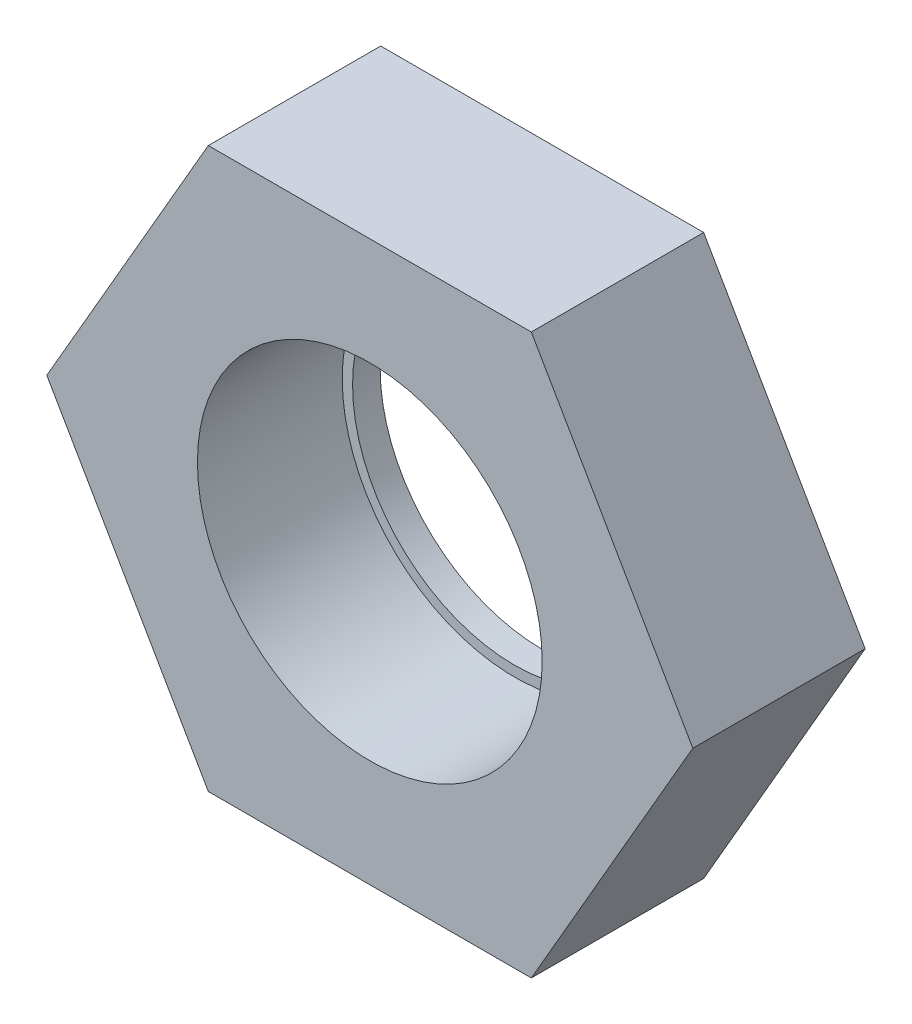
ISO-10303-21;
HEADER;
FILE_DESCRIPTION(('STEP AP214'),'2;1');
FILE_NAME('part.step','',(''),(''),'','','');
FILE_SCHEMA(('AUTOMOTIVE_DESIGN { 1 0 10303 214 1 1 1 1 }'));
ENDSEC;
DATA;
#1=APPLICATION_CONTEXT('core data for automotive mechanical design processes');
#2=APPLICATION_PROTOCOL_DEFINITION('international standard','automotive_design',2000,#1);
#3=PRODUCT_CONTEXT('',#1,'mechanical');
#4=PRODUCT('Part','Part','',(#3));
#5=PRODUCT_RELATED_PRODUCT_CATEGORY('part','',(#4));
#6=PRODUCT_DEFINITION_FORMATION('','',#4);
#7=PRODUCT_DEFINITION_CONTEXT('part definition',#1,'design');
#8=PRODUCT_DEFINITION('design','',#6,#7);
#9=PRODUCT_DEFINITION_SHAPE('','',#8);
#10=(LENGTH_UNIT() NAMED_UNIT(*) SI_UNIT(.MILLI.,.METRE.));
#11=(NAMED_UNIT(*) PLANE_ANGLE_UNIT() SI_UNIT($,.RADIAN.));
#12=(NAMED_UNIT(*) SI_UNIT($,.STERADIAN.) SOLID_ANGLE_UNIT());
#13=UNCERTAINTY_MEASURE_WITH_UNIT(LENGTH_MEASURE(1.E-05),#10,'distance_accuracy_value','');
#14=(GEOMETRIC_REPRESENTATION_CONTEXT(3) GLOBAL_UNCERTAINTY_ASSIGNED_CONTEXT((#13)) GLOBAL_UNIT_ASSIGNED_CONTEXT((#10,
#11,#12)) REPRESENTATION_CONTEXT('',''));
#15=CARTESIAN_POINT('',(0.,0.,0.));
#16=DIRECTION('',(0.,0.,1.));
#17=DIRECTION('',(1.,0.,0.));
#18=AXIS2_PLACEMENT_3D('',#15,#16,#17);
#19=CARTESIAN_POINT('',(-12.0419793196,-10.3049999894,6.35));
#20=DIRECTION('',(0.,0.,1.));
#21=DIRECTION('',(1.,0.,0.));
#22=AXIS2_PLACEMENT_3D('',#19,#20,#21);
#23=PLANE('',#22);
#24=CARTESIAN_POINT('',(0.,0.,6.35));
#25=DIRECTION('',(0.,0.,-1.));
#26=DIRECTION('',(-1.,0.,0.));
#27=AXIS2_PLACEMENT_3D('',#24,#25,#26);
#28=CIRCLE('',#27,6.35);
#29=CARTESIAN_POINT('',(-6.35,0.,6.35));
#30=VERTEX_POINT('',#29);
#31=EDGE_CURVE('E20',#30,#30,#28,.F.);
#32=ORIENTED_EDGE('',*,*,#31,.F.);
#33=EDGE_LOOP('',(#32));
#34=FACE_BOUND('',#33,.T.);
#35=DIRECTION('',(0.500000000574881,-0.866025403452531,0.));
#36=VECTOR('',#35,1.);
#37=CARTESIAN_POINT('',(8.9243917905,5.1524999947,6.35));
#38=LINE('',#37,#36);
#39=CARTESIAN_POINT('',(5.94959452477154,10.3049999894,6.35));
#40=VERTEX_POINT('',#39);
#41=CARTESIAN_POINT('',(11.8991890461852,-5.81603883977044E-09,6.35));
#42=VERTEX_POINT('',#41);
#43=EDGE_CURVE('E81',#40,#42,#38,.T.);
#44=ORIENTED_EDGE('',*,*,#43,.F.);
#45=DIRECTION('',(1.,0.,0.));
#46=VECTOR('',#45,1.);
#47=CARTESIAN_POINT('',(0.,10.3049999894,6.35));
#48=LINE('',#47,#46);
#49=CARTESIAN_POINT('',(-5.94959452477154,10.3049999894,6.35));
#50=VERTEX_POINT('',#49);
#51=EDGE_CURVE('E76',#50,#40,#48,.T.);
#52=ORIENTED_EDGE('',*,*,#51,.F.);
#53=DIRECTION('',(0.500000000574881,0.866025403452531,0.));
#54=VECTOR('',#53,1.);
#55=CARTESIAN_POINT('',(-8.9243917905,5.1524999947,6.35));
#56=LINE('',#55,#54);
#57=CARTESIAN_POINT('',(-11.8991890461852,5.81603883977044E-09,6.35));
#58=VERTEX_POINT('',#57);
#59=EDGE_CURVE('E101',#58,#50,#56,.T.);
#60=ORIENTED_EDGE('',*,*,#59,.F.);
#61=DIRECTION('',(-0.500000000574881,0.866025403452531,0.));
#62=VECTOR('',#61,1.);
#63=CARTESIAN_POINT('',(-8.9243917905,-5.1524999947,6.35));
#64=LINE('',#63,#62);
#65=CARTESIAN_POINT('',(-5.94959452477154,-10.3049999894,6.35));
#66=VERTEX_POINT('',#65);
#67=EDGE_CURVE('E125',#66,#58,#64,.T.);
#68=ORIENTED_EDGE('',*,*,#67,.F.);
#69=DIRECTION('',(-1.,0.,0.));
#70=VECTOR('',#69,1.);
#71=CARTESIAN_POINT('',(0.,-10.3049999894,6.35));
#72=LINE('',#71,#70);
#73=CARTESIAN_POINT('',(5.94959452588577,-10.3049999894,6.35));
#74=VERTEX_POINT('',#73);
#75=EDGE_CURVE('E61',#74,#66,#72,.T.);
#76=ORIENTED_EDGE('',*,*,#75,.F.);
#77=DIRECTION('',(-0.500000000574881,-0.866025403452531,0.));
#78=VECTOR('',#77,1.);
#79=CARTESIAN_POINT('',(8.9243917905,-5.1524999947,6.35));
#80=LINE('',#79,#78);
#81=EDGE_CURVE('E89',#42,#74,#80,.T.);
#82=ORIENTED_EDGE('',*,*,#81,.F.);
#83=EDGE_LOOP('',(#44,#52,#60,#68,#76,#82));
#84=FACE_BOUND('',#83,.T.);
#85=ADVANCED_FACE('F16',(#34,#84),#23,.T.);
#86=CARTESIAN_POINT('',(0.,0.,6.35));
#87=DIRECTION('',(0.,0.,-1.));
#88=DIRECTION('',(-1.,0.,0.));
#89=AXIS2_PLACEMENT_3D('',#86,#87,#88);
#90=CYLINDRICAL_SURFACE('',#89,6.35);
#91=ORIENTED_EDGE('',*,*,#31,.T.);
#92=EDGE_LOOP('',(#91));
#93=FACE_BOUND('',#92,.T.);
#94=CARTESIAN_POINT('',(0.,0.,1.016));
#95=DIRECTION('',(0.,0.,-1.));
#96=DIRECTION('',(-1.,0.,0.));
#97=AXIS2_PLACEMENT_3D('',#94,#95,#96);
#98=CIRCLE('',#97,6.35);
#99=CARTESIAN_POINT('',(-6.35,0.,1.016));
#100=VERTEX_POINT('',#99);
#101=EDGE_CURVE('E116',#100,#100,#98,.F.);
#102=ORIENTED_EDGE('',*,*,#101,.F.);
#103=EDGE_LOOP('',(#102));
#104=FACE_BOUND('',#103,.T.);
#105=ADVANCED_FACE('F160',(#93,#104),#90,.F.);
#106=CARTESIAN_POINT('',(5.949594527,-10.3049999894,0.));
#107=DIRECTION('',(0.866025403452531,-0.500000000574881,0.));
#108=DIRECTION('',(0.500000000574881,0.866025403452531,0.));
#109=AXIS2_PLACEMENT_3D('',#106,#107,#108);
#110=PLANE('',#109);
#111=ORIENTED_EDGE('',*,*,#81,.T.);
#112=DIRECTION('',(0.,0.,1.));
#113=VECTOR('',#112,1.);
#114=CARTESIAN_POINT('',(5.949594527,-10.3049999894,3.175));
#115=LINE('',#114,#113);
#116=CARTESIAN_POINT('',(5.949594527,-10.3049999894,0.));
#117=VERTEX_POINT('',#116);
#118=EDGE_CURVE('E102',#117,#74,#115,.T.);
#119=ORIENTED_EDGE('',*,*,#118,.F.);
#120=DIRECTION('',(0.500000000574881,0.866025403452531,0.));
#121=VECTOR('',#120,1.);
#122=CARTESIAN_POINT('',(5.949594527,-10.3049999894,0.));
#123=LINE('',#122,#121);
#124=CARTESIAN_POINT('',(11.899189054,0.,0.));
#125=VERTEX_POINT('',#124);
#126=EDGE_CURVE('E54',#117,#125,#123,.T.);
#127=ORIENTED_EDGE('',*,*,#126,.T.);
#128=DIRECTION('',(0.,0.,-1.));
#129=VECTOR('',#128,1.);
#130=CARTESIAN_POINT('',(11.899189054,0.,3.175));
#131=LINE('',#130,#129);
#132=EDGE_CURVE('E86',#42,#125,#131,.T.);
#133=ORIENTED_EDGE('',*,*,#132,.F.);
#134=EDGE_LOOP('',(#111,#119,#127,#133));
#135=FACE_BOUND('',#134,.T.);
#136=ADVANCED_FACE('F93',(#135),#110,.T.);
#137=CARTESIAN_POINT('',(11.899189054,0.,0.));
#138=DIRECTION('',(0.866025403452531,0.500000000574881,0.));
#139=DIRECTION('',(-0.500000000574881,0.866025403452531,0.));
#140=AXIS2_PLACEMENT_3D('',#137,#138,#139);
#141=PLANE('',#140);
#142=ORIENTED_EDGE('',*,*,#43,.T.);
#143=ORIENTED_EDGE('',*,*,#132,.T.);
#144=DIRECTION('',(-0.500000000574881,0.866025403452531,0.));
#145=VECTOR('',#144,1.);
#146=CARTESIAN_POINT('',(11.899189054,0.,0.));
#147=LINE('',#146,#145);
#148=CARTESIAN_POINT('',(5.949594527,10.3049999894,0.));
#149=VERTEX_POINT('',#148);
#150=EDGE_CURVE('E114',#125,#149,#147,.T.);
#151=ORIENTED_EDGE('',*,*,#150,.T.);
#152=DIRECTION('',(0.,0.,-1.));
#153=VECTOR('',#152,1.);
#154=CARTESIAN_POINT('',(5.949594527,10.3049999894,3.175));
#155=LINE('',#154,#153);
#156=EDGE_CURVE('E87',#40,#149,#155,.T.);
#157=ORIENTED_EDGE('',*,*,#156,.F.);
#158=EDGE_LOOP('',(#142,#143,#151,#157));
#159=FACE_BOUND('',#158,.T.);
#160=ADVANCED_FACE('F83',(#159),#141,.T.);
#161=CARTESIAN_POINT('',(-5.949594527,10.3049999894,0.));
#162=DIRECTION('',(0.,1.,0.));
#163=DIRECTION('',(0.,0.,1.));
#164=AXIS2_PLACEMENT_3D('',#161,#162,#163);
#165=PLANE('',#164);
#166=ORIENTED_EDGE('',*,*,#51,.T.);
#167=ORIENTED_EDGE('',*,*,#156,.T.);
#168=DIRECTION('',(-1.,0.,0.));
#169=VECTOR('',#168,1.);
#170=CARTESIAN_POINT('',(0.,10.3049999894,0.));
#171=LINE('',#170,#169);
#172=CARTESIAN_POINT('',(-5.949594527,10.3049999894,0.));
#173=VERTEX_POINT('',#172);
#174=EDGE_CURVE('E98',#149,#173,#171,.T.);
#175=ORIENTED_EDGE('',*,*,#174,.T.);
#176=DIRECTION('',(0.,0.,-1.));
#177=VECTOR('',#176,1.);
#178=CARTESIAN_POINT('',(-5.949594527,10.3049999894,3.175));
#179=LINE('',#178,#177);
#180=EDGE_CURVE('E124',#50,#173,#179,.T.);
#181=ORIENTED_EDGE('',*,*,#180,.F.);
#182=EDGE_LOOP('',(#166,#167,#175,#181));
#183=FACE_BOUND('',#182,.T.);
#184=ADVANCED_FACE('F134',(#183),#165,.T.);
#185=CARTESIAN_POINT('',(-5.949594527,10.3049999894,0.));
#186=DIRECTION('',(-0.866025403452531,0.500000000574881,0.));
#187=DIRECTION('',(-0.500000000574881,-0.866025403452531,0.));
#188=AXIS2_PLACEMENT_3D('',#185,#186,#187);
#189=PLANE('',#188);
#190=ORIENTED_EDGE('',*,*,#59,.T.);
#191=ORIENTED_EDGE('',*,*,#180,.T.);
#192=DIRECTION('',(-0.500000000574881,-0.866025403452531,0.));
#193=VECTOR('',#192,1.);
#194=CARTESIAN_POINT('',(-5.949594527,10.3049999894,0.));
#195=LINE('',#194,#193);
#196=CARTESIAN_POINT('',(-11.899189054,0.,0.));
#197=VERTEX_POINT('',#196);
#198=EDGE_CURVE('E111',#173,#197,#195,.T.);
#199=ORIENTED_EDGE('',*,*,#198,.T.);
#200=DIRECTION('',(0.,0.,-1.));
#201=VECTOR('',#200,1.);
#202=CARTESIAN_POINT('',(-11.899189054,0.,3.175));
#203=LINE('',#202,#201);
#204=EDGE_CURVE('E103',#58,#197,#203,.T.);
#205=ORIENTED_EDGE('',*,*,#204,.F.);
#206=EDGE_LOOP('',(#190,#191,#199,#205));
#207=FACE_BOUND('',#206,.T.);
#208=ADVANCED_FACE('F132',(#207),#189,.T.);
#209=CARTESIAN_POINT('',(-11.899189054,0.,0.));
#210=DIRECTION('',(-0.866025403452531,-0.500000000574881,0.));
#211=DIRECTION('',(0.500000000574881,-0.866025403452531,0.));
#212=AXIS2_PLACEMENT_3D('',#209,#210,#211);
#213=PLANE('',#212);
#214=ORIENTED_EDGE('',*,*,#67,.T.);
#215=ORIENTED_EDGE('',*,*,#204,.T.);
#216=DIRECTION('',(0.500000000574881,-0.866025403452531,0.));
#217=VECTOR('',#216,1.);
#218=CARTESIAN_POINT('',(-11.899189054,0.,0.));
#219=LINE('',#218,#217);
#220=CARTESIAN_POINT('',(-5.949594527,-10.3049999894,0.));
#221=VERTEX_POINT('',#220);
#222=EDGE_CURVE('E108',#197,#221,#219,.T.);
#223=ORIENTED_EDGE('',*,*,#222,.T.);
#224=DIRECTION('',(0.,0.,-1.));
#225=VECTOR('',#224,1.);
#226=CARTESIAN_POINT('',(-5.949594527,-10.3049999894,3.175));
#227=LINE('',#226,#225);
#228=EDGE_CURVE('E35',#66,#221,#227,.T.);
#229=ORIENTED_EDGE('',*,*,#228,.F.);
#230=EDGE_LOOP('',(#214,#215,#223,#229));
#231=FACE_BOUND('',#230,.T.);
#232=ADVANCED_FACE('F138',(#231),#213,.T.);
#233=CARTESIAN_POINT('',(-5.949594527,-10.3049999894,0.));
#234=DIRECTION('',(0.,-1.,0.));
#235=DIRECTION('',(1.,0.,0.));
#236=AXIS2_PLACEMENT_3D('',#233,#234,#235);
#237=PLANE('',#236);
#238=ORIENTED_EDGE('',*,*,#75,.T.);
#239=ORIENTED_EDGE('',*,*,#228,.T.);
#240=DIRECTION('',(1.,0.,0.));
#241=VECTOR('',#240,1.);
#242=CARTESIAN_POINT('',(0.,-10.3049999894,0.));
#243=LINE('',#242,#241);
#244=EDGE_CURVE('E107',#221,#117,#243,.T.);
#245=ORIENTED_EDGE('',*,*,#244,.T.);
#246=ORIENTED_EDGE('',*,*,#118,.T.);
#247=EDGE_LOOP('',(#238,#239,#245,#246));
#248=FACE_BOUND('',#247,.T.);
#249=ADVANCED_FACE('F140',(#248),#237,.T.);
#250=CARTESIAN_POINT('',(-6.4262,-6.4262,1.016));
#251=DIRECTION('',(0.,0.,1.));
#252=DIRECTION('',(1.,0.,0.));
#253=AXIS2_PLACEMENT_3D('',#250,#251,#252);
#254=PLANE('',#253);
#255=CARTESIAN_POINT('',(0.,0.,1.016));
#256=DIRECTION('',(0.,0.,-1.));
#257=DIRECTION('',(0.,1.,0.));
#258=AXIS2_PLACEMENT_3D('',#255,#256,#257);
#259=CIRCLE('',#258,5.969);
#260=CARTESIAN_POINT('',(0.,5.969,1.016));
#261=VERTEX_POINT('',#260);
#262=EDGE_CURVE('E26',#261,#261,#259,.F.);
#263=ORIENTED_EDGE('',*,*,#262,.F.);
#264=EDGE_LOOP('',(#263));
#265=FACE_BOUND('',#264,.T.);
#266=ORIENTED_EDGE('',*,*,#101,.T.);
#267=EDGE_LOOP('',(#266));
#268=FACE_BOUND('',#267,.T.);
#269=ADVANCED_FACE('F147',(#265,#268),#254,.T.);
#270=CARTESIAN_POINT('',(-12.0419793196,-10.3049999894,0.));
#271=DIRECTION('',(0.,0.,1.));
#272=DIRECTION('',(1.,0.,0.));
#273=AXIS2_PLACEMENT_3D('',#270,#271,#272);
#274=PLANE('',#273);
#275=CARTESIAN_POINT('',(0.,0.,0.));
#276=DIRECTION('',(0.,0.,-1.));
#277=DIRECTION('',(0.,1.,0.));
#278=AXIS2_PLACEMENT_3D('',#275,#276,#277);
#279=CIRCLE('',#278,5.969);
#280=CARTESIAN_POINT('',(0.,5.969,0.));
#281=VERTEX_POINT('',#280);
#282=EDGE_CURVE('E11',#281,#281,#279,.T.);
#283=ORIENTED_EDGE('',*,*,#282,.F.);
#284=EDGE_LOOP('',(#283));
#285=FACE_BOUND('',#284,.T.);
#286=ORIENTED_EDGE('',*,*,#222,.F.);
#287=ORIENTED_EDGE('',*,*,#198,.F.);
#288=ORIENTED_EDGE('',*,*,#174,.F.);
#289=ORIENTED_EDGE('',*,*,#150,.F.);
#290=ORIENTED_EDGE('',*,*,#126,.F.);
#291=ORIENTED_EDGE('',*,*,#244,.F.);
#292=EDGE_LOOP('',(#286,#287,#288,#289,#290,#291));
#293=FACE_BOUND('',#292,.T.);
#294=ADVANCED_FACE('F18',(#285,#293),#274,.F.);
#295=CARTESIAN_POINT('',(0.,0.,1.016));
#296=DIRECTION('',(0.,0.,-1.));
#297=DIRECTION('',(0.,1.,0.));
#298=AXIS2_PLACEMENT_3D('',#295,#296,#297);
#299=CYLINDRICAL_SURFACE('',#298,5.969);
#300=ORIENTED_EDGE('',*,*,#262,.T.);
#301=EDGE_LOOP('',(#300));
#302=FACE_BOUND('',#301,.T.);
#303=ORIENTED_EDGE('',*,*,#282,.T.);
#304=EDGE_LOOP('',(#303));
#305=FACE_BOUND('',#304,.T.);
#306=ADVANCED_FACE('F150',(#302,#305),#299,.F.);
#307=CLOSED_SHELL('',(#85,#105,#136,#160,#184,#208,#232,#249,#269,#294,#306));
#308=MANIFOLD_SOLID_BREP('B1',#307);
#309=ADVANCED_BREP_SHAPE_REPRESENTATION('',(#18,#308),#14);
#310=SHAPE_DEFINITION_REPRESENTATION(#9,#309);
ENDSEC;
END-ISO-10303-21;
